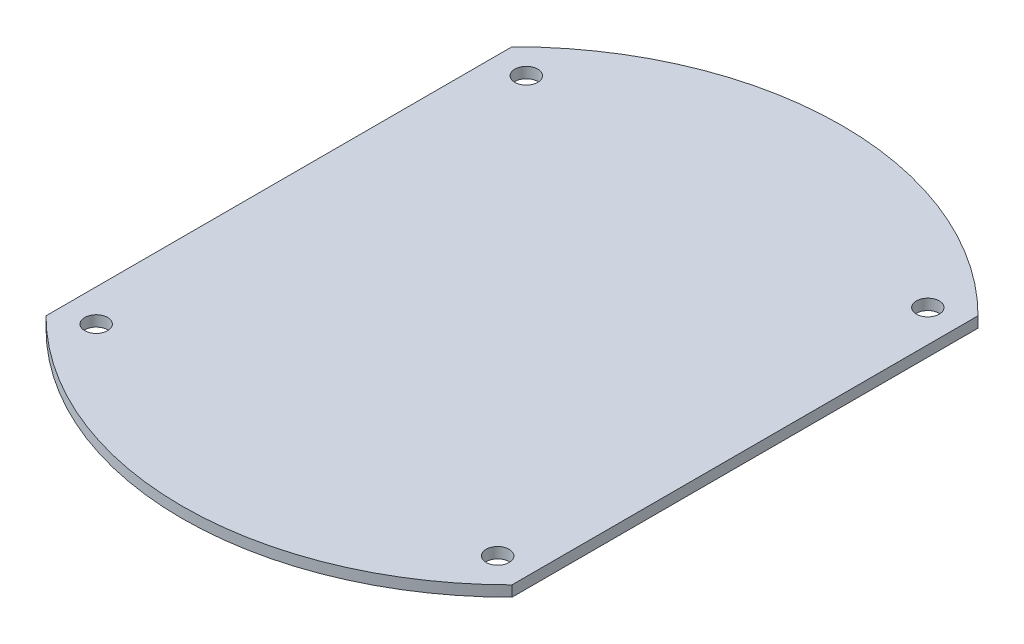
ISO-10303-21;
HEADER;
FILE_DESCRIPTION(('STEP AP214'),'2;1');
FILE_NAME('part.step','',(''),(''),'','','');
FILE_SCHEMA(('AUTOMOTIVE_DESIGN { 1 0 10303 214 1 1 1 1 }'));
ENDSEC;
DATA;
#1=APPLICATION_CONTEXT('core data for automotive mechanical design processes');
#2=APPLICATION_PROTOCOL_DEFINITION('international standard','automotive_design',2000,#1);
#3=PRODUCT_CONTEXT('',#1,'mechanical');
#4=PRODUCT('Part','Part','',(#3));
#5=PRODUCT_RELATED_PRODUCT_CATEGORY('part','',(#4));
#6=PRODUCT_DEFINITION_FORMATION('','',#4);
#7=PRODUCT_DEFINITION_CONTEXT('part definition',#1,'design');
#8=PRODUCT_DEFINITION('design','',#6,#7);
#9=PRODUCT_DEFINITION_SHAPE('','',#8);
#10=(LENGTH_UNIT() NAMED_UNIT(*) SI_UNIT(.MILLI.,.METRE.));
#11=(NAMED_UNIT(*) PLANE_ANGLE_UNIT() SI_UNIT($,.RADIAN.));
#12=(NAMED_UNIT(*) SI_UNIT($,.STERADIAN.) SOLID_ANGLE_UNIT());
#13=UNCERTAINTY_MEASURE_WITH_UNIT(LENGTH_MEASURE(1.E-05),#10,'distance_accuracy_value','');
#14=(GEOMETRIC_REPRESENTATION_CONTEXT(3) GLOBAL_UNCERTAINTY_ASSIGNED_CONTEXT((#13)) GLOBAL_UNIT_ASSIGNED_CONTEXT((#10,
#11,#12)) REPRESENTATION_CONTEXT('',''));
#15=CARTESIAN_POINT('',(0.,0.,0.));
#16=DIRECTION('',(0.,0.,1.));
#17=DIRECTION('',(1.,0.,0.));
#18=AXIS2_PLACEMENT_3D('',#15,#16,#17);
#19=CARTESIAN_POINT('',(0.,1.5,0.129629629629639));
#20=DIRECTION('',(0.,-1.,0.));
#21=DIRECTION('',(0.,0.,-1.));
#22=AXIS2_PLACEMENT_3D('',#19,#20,#21);
#23=CYLINDRICAL_SURFACE('',#22,45.8703703703704);
#24=CARTESIAN_POINT('',(0.,0.,0.129629629629639));
#25=DIRECTION('',(0.,1.,0.));
#26=DIRECTION('',(0.,0.,1.));
#27=AXIS2_PLACEMENT_3D('',#24,#25,#26);
#28=CIRCLE('',#27,45.8703703703704);
#29=CARTESIAN_POINT('',(-32.5,0.,32.5));
#30=VERTEX_POINT('',#29);
#31=CARTESIAN_POINT('',(32.5,0.,32.5));
#32=VERTEX_POINT('',#31);
#33=EDGE_CURVE('E111',#30,#32,#28,.T.);
#34=ORIENTED_EDGE('',*,*,#33,.T.);
#35=DIRECTION('',(0.,-1.,0.));
#36=VECTOR('',#35,1.);
#37=CARTESIAN_POINT('',(32.5,1.5,32.5));
#38=LINE('',#37,#36);
#39=CARTESIAN_POINT('',(32.5,1.5,32.5));
#40=VERTEX_POINT('',#39);
#41=EDGE_CURVE('E11',#40,#32,#38,.T.);
#42=ORIENTED_EDGE('',*,*,#41,.F.);
#43=CARTESIAN_POINT('',(0.,1.5,0.129629629629639));
#44=DIRECTION('',(0.,1.,0.));
#45=DIRECTION('',(0.,0.,1.));
#46=AXIS2_PLACEMENT_3D('',#43,#44,#45);
#47=CIRCLE('',#46,45.8703703703704);
#48=CARTESIAN_POINT('',(-32.5,1.5,32.5));
#49=VERTEX_POINT('',#48);
#50=EDGE_CURVE('E85',#49,#40,#47,.T.);
#51=ORIENTED_EDGE('',*,*,#50,.F.);
#52=DIRECTION('',(0.,-1.,0.));
#53=VECTOR('',#52,1.);
#54=CARTESIAN_POINT('',(-32.5,1.5,32.5));
#55=LINE('',#54,#53);
#56=EDGE_CURVE('E51',#49,#30,#55,.T.);
#57=ORIENTED_EDGE('',*,*,#56,.T.);
#58=EDGE_LOOP('',(#34,#42,#51,#57));
#59=FACE_BOUND('',#58,.T.);
#60=ADVANCED_FACE('F35',(#59),#23,.T.);
#61=CARTESIAN_POINT('',(32.5,1.5,0.));
#62=DIRECTION('',(-1.,0.,0.));
#63=DIRECTION('',(0.,0.,1.));
#64=AXIS2_PLACEMENT_3D('',#61,#62,#63);
#65=PLANE('',#64);
#66=DIRECTION('',(0.,0.,-1.));
#67=VECTOR('',#66,1.);
#68=CARTESIAN_POINT('',(32.5,0.,0.));
#69=LINE('',#68,#67);
#70=CARTESIAN_POINT('',(32.5,0.,-32.5));
#71=VERTEX_POINT('',#70);
#72=EDGE_CURVE('E90',#32,#71,#69,.T.);
#73=ORIENTED_EDGE('',*,*,#72,.T.);
#74=DIRECTION('',(0.,-1.,0.));
#75=VECTOR('',#74,1.);
#76=CARTESIAN_POINT('',(32.5,1.5,-32.5));
#77=LINE('',#76,#75);
#78=CARTESIAN_POINT('',(32.5,1.5,-32.5));
#79=VERTEX_POINT('',#78);
#80=EDGE_CURVE('E43',#79,#71,#77,.T.);
#81=ORIENTED_EDGE('',*,*,#80,.F.);
#82=DIRECTION('',(0.,0.,-1.));
#83=VECTOR('',#82,1.);
#84=CARTESIAN_POINT('',(32.5,1.5,0.));
#85=LINE('',#84,#83);
#86=EDGE_CURVE('E76',#40,#79,#85,.T.);
#87=ORIENTED_EDGE('',*,*,#86,.F.);
#88=ORIENTED_EDGE('',*,*,#41,.T.);
#89=EDGE_LOOP('',(#73,#81,#87,#88));
#90=FACE_BOUND('',#89,.T.);
#91=ADVANCED_FACE('F89',(#90),#65,.F.);
#92=CARTESIAN_POINT('',(0.,1.5,-0.129629629629639));
#93=DIRECTION('',(0.,-1.,0.));
#94=DIRECTION('',(0.,0.,-1.));
#95=AXIS2_PLACEMENT_3D('',#92,#93,#94);
#96=CYLINDRICAL_SURFACE('',#95,45.8703703703704);
#97=CARTESIAN_POINT('',(0.,0.,-0.129629629629639));
#98=DIRECTION('',(0.,1.,0.));
#99=DIRECTION('',(0.,0.,1.));
#100=AXIS2_PLACEMENT_3D('',#97,#98,#99);
#101=CIRCLE('',#100,45.8703703703704);
#102=CARTESIAN_POINT('',(-32.5,0.,-32.5));
#103=VERTEX_POINT('',#102);
#104=EDGE_CURVE('E114',#103,#71,#101,.F.);
#105=ORIENTED_EDGE('',*,*,#104,.F.);
#106=DIRECTION('',(0.,-1.,0.));
#107=VECTOR('',#106,1.);
#108=CARTESIAN_POINT('',(-32.5,1.5,-32.5));
#109=LINE('',#108,#107);
#110=CARTESIAN_POINT('',(-32.5,1.5,-32.5));
#111=VERTEX_POINT('',#110);
#112=EDGE_CURVE('E65',#111,#103,#109,.T.);
#113=ORIENTED_EDGE('',*,*,#112,.F.);
#114=CARTESIAN_POINT('',(0.,1.5,-0.129629629629639));
#115=DIRECTION('',(0.,1.,0.));
#116=DIRECTION('',(0.,0.,1.));
#117=AXIS2_PLACEMENT_3D('',#114,#115,#116);
#118=CIRCLE('',#117,45.8703703703704);
#119=EDGE_CURVE('E84',#111,#79,#118,.F.);
#120=ORIENTED_EDGE('',*,*,#119,.T.);
#121=ORIENTED_EDGE('',*,*,#80,.T.);
#122=EDGE_LOOP('',(#105,#113,#120,#121));
#123=FACE_BOUND('',#122,.T.);
#124=ADVANCED_FACE('F93',(#123),#96,.T.);
#125=CARTESIAN_POINT('',(28.,1.5,-30.));
#126=DIRECTION('',(0.,-1.,0.));
#127=DIRECTION('',(0.,0.,-1.));
#128=AXIS2_PLACEMENT_3D('',#125,#126,#127);
#129=CYLINDRICAL_SURFACE('',#128,1.6);
#130=CARTESIAN_POINT('',(28.,1.5,-30.));
#131=DIRECTION('',(0.,1.,0.));
#132=DIRECTION('',(0.,0.,1.));
#133=AXIS2_PLACEMENT_3D('',#130,#131,#132);
#134=CIRCLE('',#133,1.6);
#135=CARTESIAN_POINT('',(28.,1.5,-28.4));
#136=VERTEX_POINT('',#135);
#137=EDGE_CURVE('E105',#136,#136,#134,.T.);
#138=ORIENTED_EDGE('',*,*,#137,.T.);
#139=EDGE_LOOP('',(#138));
#140=FACE_BOUND('',#139,.T.);
#141=CARTESIAN_POINT('',(28.,0.,-30.));
#142=DIRECTION('',(0.,1.,0.));
#143=DIRECTION('',(0.,0.,1.));
#144=AXIS2_PLACEMENT_3D('',#141,#142,#143);
#145=CIRCLE('',#144,1.6);
#146=CARTESIAN_POINT('',(28.,0.,-28.4));
#147=VERTEX_POINT('',#146);
#148=EDGE_CURVE('E125',#147,#147,#145,.T.);
#149=ORIENTED_EDGE('',*,*,#148,.F.);
#150=EDGE_LOOP('',(#149));
#151=FACE_BOUND('',#150,.T.);
#152=ADVANCED_FACE('F165',(#140,#151),#129,.F.);
#153=CARTESIAN_POINT('',(-28.0000000000002,1.5,-30.));
#154=DIRECTION('',(0.,-1.,0.));
#155=DIRECTION('',(0.,0.,-1.));
#156=AXIS2_PLACEMENT_3D('',#153,#154,#155);
#157=CYLINDRICAL_SURFACE('',#156,1.60000000000001);
#158=CARTESIAN_POINT('',(-28.0000000000002,1.5,-30.));
#159=DIRECTION('',(0.,1.,0.));
#160=DIRECTION('',(0.,0.,1.));
#161=AXIS2_PLACEMENT_3D('',#158,#159,#160);
#162=CIRCLE('',#161,1.60000000000001);
#163=CARTESIAN_POINT('',(-28.0000000000002,1.5,-28.4));
#164=VERTEX_POINT('',#163);
#165=EDGE_CURVE('E102',#164,#164,#162,.F.);
#166=ORIENTED_EDGE('',*,*,#165,.F.);
#167=EDGE_LOOP('',(#166));
#168=FACE_BOUND('',#167,.T.);
#169=CARTESIAN_POINT('',(-28.0000000000002,0.,-30.));
#170=DIRECTION('',(0.,1.,0.));
#171=DIRECTION('',(0.,0.,1.));
#172=AXIS2_PLACEMENT_3D('',#169,#170,#171);
#173=CIRCLE('',#172,1.60000000000001);
#174=CARTESIAN_POINT('',(-28.0000000000002,0.,-28.4));
#175=VERTEX_POINT('',#174);
#176=EDGE_CURVE('E122',#175,#175,#173,.F.);
#177=ORIENTED_EDGE('',*,*,#176,.T.);
#178=EDGE_LOOP('',(#177));
#179=FACE_BOUND('',#178,.T.);
#180=ADVANCED_FACE('F159',(#168,#179),#157,.F.);
#181=CARTESIAN_POINT('',(-28.0000000000002,1.5,30.));
#182=DIRECTION('',(0.,-1.,0.));
#183=DIRECTION('',(0.,0.,-1.));
#184=AXIS2_PLACEMENT_3D('',#181,#182,#183);
#185=CYLINDRICAL_SURFACE('',#184,1.60000000000001);
#186=CARTESIAN_POINT('',(-28.0000000000002,1.5,30.));
#187=DIRECTION('',(0.,1.,0.));
#188=DIRECTION('',(0.,0.,1.));
#189=AXIS2_PLACEMENT_3D('',#186,#187,#188);
#190=CIRCLE('',#189,1.60000000000001);
#191=CARTESIAN_POINT('',(-28.0000000000002,1.5,31.6000000000001));
#192=VERTEX_POINT('',#191);
#193=EDGE_CURVE('E96',#192,#192,#190,.T.);
#194=ORIENTED_EDGE('',*,*,#193,.T.);
#195=EDGE_LOOP('',(#194));
#196=FACE_BOUND('',#195,.T.);
#197=CARTESIAN_POINT('',(-28.0000000000002,0.,30.));
#198=DIRECTION('',(0.,1.,0.));
#199=DIRECTION('',(0.,0.,1.));
#200=AXIS2_PLACEMENT_3D('',#197,#198,#199);
#201=CIRCLE('',#200,1.60000000000001);
#202=CARTESIAN_POINT('',(-28.0000000000002,0.,31.6000000000001));
#203=VERTEX_POINT('',#202);
#204=EDGE_CURVE('E119',#203,#203,#201,.T.);
#205=ORIENTED_EDGE('',*,*,#204,.F.);
#206=EDGE_LOOP('',(#205));
#207=FACE_BOUND('',#206,.T.);
#208=ADVANCED_FACE('F152',(#196,#207),#185,.F.);
#209=CARTESIAN_POINT('',(-32.5,1.5,0.));
#210=DIRECTION('',(-1.,0.,0.));
#211=DIRECTION('',(0.,0.,1.));
#212=AXIS2_PLACEMENT_3D('',#209,#210,#211);
#213=PLANE('',#212);
#214=DIRECTION('',(0.,0.,-1.));
#215=VECTOR('',#214,1.);
#216=CARTESIAN_POINT('',(-32.5,0.,0.));
#217=LINE('',#216,#215);
#218=EDGE_CURVE('E116',#30,#103,#217,.T.);
#219=ORIENTED_EDGE('',*,*,#218,.F.);
#220=ORIENTED_EDGE('',*,*,#56,.F.);
#221=DIRECTION('',(0.,0.,-1.));
#222=VECTOR('',#221,1.);
#223=CARTESIAN_POINT('',(-32.5,1.5,0.));
#224=LINE('',#223,#222);
#225=EDGE_CURVE('E94',#49,#111,#224,.T.);
#226=ORIENTED_EDGE('',*,*,#225,.T.);
#227=ORIENTED_EDGE('',*,*,#112,.T.);
#228=EDGE_LOOP('',(#219,#220,#226,#227));
#229=FACE_BOUND('',#228,.T.);
#230=ADVANCED_FACE('F150',(#229),#213,.T.);
#231=CARTESIAN_POINT('',(28.,1.5,30.));
#232=DIRECTION('',(0.,-1.,0.));
#233=DIRECTION('',(0.,0.,-1.));
#234=AXIS2_PLACEMENT_3D('',#231,#232,#233);
#235=CYLINDRICAL_SURFACE('',#234,1.6);
#236=CARTESIAN_POINT('',(28.,1.5,30.));
#237=DIRECTION('',(0.,1.,0.));
#238=DIRECTION('',(0.,0.,1.));
#239=AXIS2_PLACEMENT_3D('',#236,#237,#238);
#240=CIRCLE('',#239,1.6);
#241=CARTESIAN_POINT('',(28.,1.5,31.6));
#242=VERTEX_POINT('',#241);
#243=EDGE_CURVE('E108',#242,#242,#240,.F.);
#244=ORIENTED_EDGE('',*,*,#243,.F.);
#245=EDGE_LOOP('',(#244));
#246=FACE_BOUND('',#245,.T.);
#247=CARTESIAN_POINT('',(28.,0.,30.));
#248=DIRECTION('',(0.,1.,0.));
#249=DIRECTION('',(0.,0.,1.));
#250=AXIS2_PLACEMENT_3D('',#247,#248,#249);
#251=CIRCLE('',#250,1.6);
#252=CARTESIAN_POINT('',(28.,0.,31.6));
#253=VERTEX_POINT('',#252);
#254=EDGE_CURVE('E128',#253,#253,#251,.F.);
#255=ORIENTED_EDGE('',*,*,#254,.T.);
#256=EDGE_LOOP('',(#255));
#257=FACE_BOUND('',#256,.T.);
#258=ADVANCED_FACE('F134',(#246,#257),#235,.F.);
#259=CARTESIAN_POINT('',(0.,1.5,0.));
#260=DIRECTION('',(0.,1.,0.));
#261=DIRECTION('',(0.,0.,1.));
#262=AXIS2_PLACEMENT_3D('',#259,#260,#261);
#263=PLANE('',#262);
#264=ORIENTED_EDGE('',*,*,#50,.T.);
#265=ORIENTED_EDGE('',*,*,#86,.T.);
#266=ORIENTED_EDGE('',*,*,#119,.F.);
#267=ORIENTED_EDGE('',*,*,#225,.F.);
#268=EDGE_LOOP('',(#264,#265,#266,#267));
#269=FACE_BOUND('',#268,.T.);
#270=ORIENTED_EDGE('',*,*,#193,.F.);
#271=EDGE_LOOP('',(#270));
#272=FACE_BOUND('',#271,.T.);
#273=ORIENTED_EDGE('',*,*,#165,.T.);
#274=EDGE_LOOP('',(#273));
#275=FACE_BOUND('',#274,.T.);
#276=ORIENTED_EDGE('',*,*,#137,.F.);
#277=EDGE_LOOP('',(#276));
#278=FACE_BOUND('',#277,.T.);
#279=ORIENTED_EDGE('',*,*,#243,.T.);
#280=EDGE_LOOP('',(#279));
#281=FACE_BOUND('',#280,.T.);
#282=ADVANCED_FACE('F80',(#269,#272,#275,#278,#281),#263,.T.);
#283=CARTESIAN_POINT('',(0.,0.,0.));
#284=DIRECTION('',(0.,1.,0.));
#285=DIRECTION('',(0.,0.,1.));
#286=AXIS2_PLACEMENT_3D('',#283,#284,#285);
#287=PLANE('',#286);
#288=ORIENTED_EDGE('',*,*,#33,.F.);
#289=ORIENTED_EDGE('',*,*,#218,.T.);
#290=ORIENTED_EDGE('',*,*,#104,.T.);
#291=ORIENTED_EDGE('',*,*,#72,.F.);
#292=EDGE_LOOP('',(#288,#289,#290,#291));
#293=FACE_BOUND('',#292,.T.);
#294=ORIENTED_EDGE('',*,*,#204,.T.);
#295=EDGE_LOOP('',(#294));
#296=FACE_BOUND('',#295,.T.);
#297=ORIENTED_EDGE('',*,*,#176,.F.);
#298=EDGE_LOOP('',(#297));
#299=FACE_BOUND('',#298,.T.);
#300=ORIENTED_EDGE('',*,*,#148,.T.);
#301=EDGE_LOOP('',(#300));
#302=FACE_BOUND('',#301,.T.);
#303=ORIENTED_EDGE('',*,*,#254,.F.);
#304=EDGE_LOOP('',(#303));
#305=FACE_BOUND('',#304,.T.);
#306=ADVANCED_FACE('F136',(#293,#296,#299,#302,#305),#287,.F.);
#307=CLOSED_SHELL('',(#60,#91,#124,#152,#180,#208,#230,#258,#282,#306));
#308=MANIFOLD_SOLID_BREP('B2',#307);
#309=ADVANCED_BREP_SHAPE_REPRESENTATION('',(#18,#308),#14);
#310=SHAPE_DEFINITION_REPRESENTATION(#9,#309);
ENDSEC;
END-ISO-10303-21;
